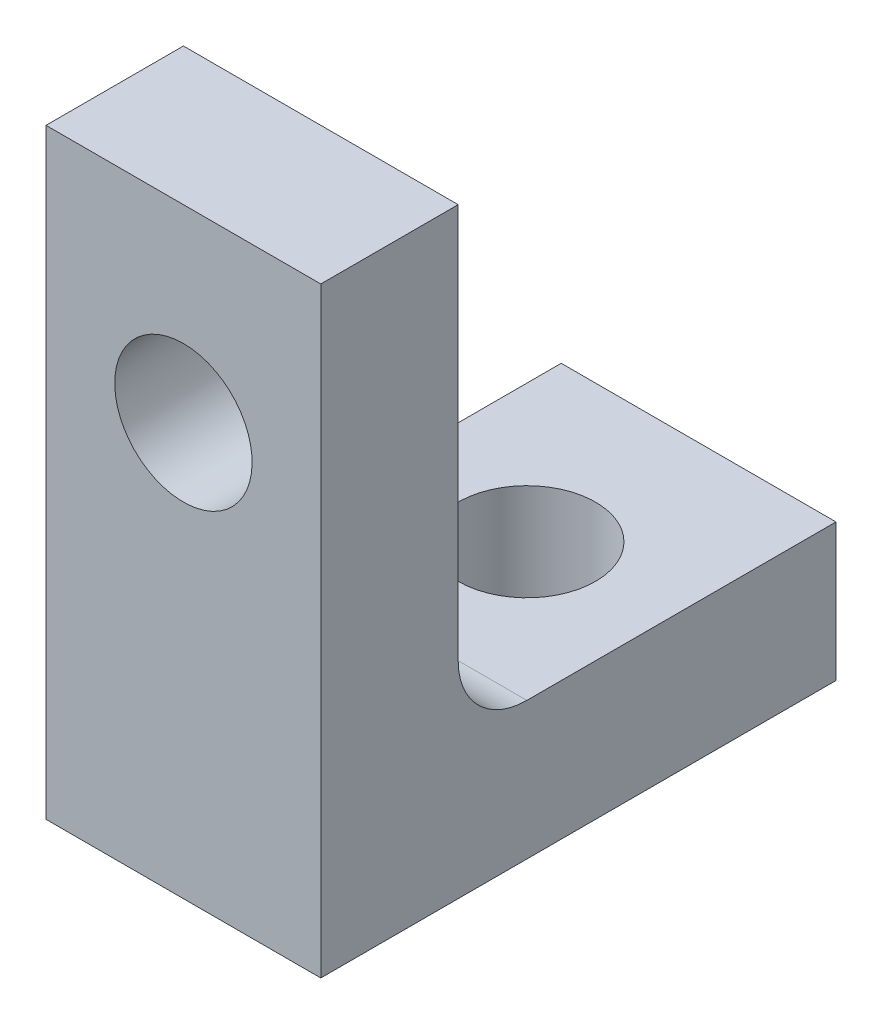
ISO-10303-21;
HEADER;
FILE_DESCRIPTION(('STEP AP214'),'2;1');
FILE_NAME('part.step','',(''),(''),'','','');
FILE_SCHEMA(('AUTOMOTIVE_DESIGN { 1 0 10303 214 1 1 1 1 }'));
ENDSEC;
DATA;
#1=APPLICATION_CONTEXT('core data for automotive mechanical design processes');
#2=APPLICATION_PROTOCOL_DEFINITION('international standard','automotive_design',2000,#1);
#3=PRODUCT_CONTEXT('',#1,'mechanical');
#4=PRODUCT('Part','Part','',(#3));
#5=PRODUCT_RELATED_PRODUCT_CATEGORY('part','',(#4));
#6=PRODUCT_DEFINITION_FORMATION('','',#4);
#7=PRODUCT_DEFINITION_CONTEXT('part definition',#1,'design');
#8=PRODUCT_DEFINITION('design','',#6,#7);
#9=PRODUCT_DEFINITION_SHAPE('','',#8);
#10=(LENGTH_UNIT() NAMED_UNIT(*) SI_UNIT(.MILLI.,.METRE.));
#11=(NAMED_UNIT(*) PLANE_ANGLE_UNIT() SI_UNIT($,.RADIAN.));
#12=(NAMED_UNIT(*) SI_UNIT($,.STERADIAN.) SOLID_ANGLE_UNIT());
#13=UNCERTAINTY_MEASURE_WITH_UNIT(LENGTH_MEASURE(1.E-05),#10,'distance_accuracy_value','');
#14=(GEOMETRIC_REPRESENTATION_CONTEXT(3) GLOBAL_UNCERTAINTY_ASSIGNED_CONTEXT((#13)) GLOBAL_UNIT_ASSIGNED_CONTEXT((#10,
#11,#12)) REPRESENTATION_CONTEXT('',''));
#15=CARTESIAN_POINT('',(0.,0.,0.));
#16=DIRECTION('',(0.,0.,1.));
#17=DIRECTION('',(1.,0.,0.));
#18=AXIS2_PLACEMENT_3D('',#15,#16,#17);
#19=CARTESIAN_POINT('',(4.,0.,-5.5));
#20=DIRECTION('',(0.,-1.,0.));
#21=DIRECTION('',(0.,0.,-1.));
#22=AXIS2_PLACEMENT_3D('',#19,#20,#21);
#23=PLANE('',#22);
#24=CARTESIAN_POINT('',(2.,0.,-3.));
#25=DIRECTION('',(0.,1.,0.));
#26=DIRECTION('',(0.,0.,1.));
#27=AXIS2_PLACEMENT_3D('',#24,#25,#26);
#28=CIRCLE('',#27,1.);
#29=CARTESIAN_POINT('',(2.,0.,-2.));
#30=VERTEX_POINT('',#29);
#31=EDGE_CURVE('E176',#30,#30,#28,.T.);
#32=ORIENTED_EDGE('',*,*,#31,.F.);
#33=EDGE_LOOP('',(#32));
#34=FACE_BOUND('',#33,.T.);
#35=DIRECTION('',(0.,0.,1.));
#36=VECTOR('',#35,1.);
#37=CARTESIAN_POINT('',(0.,0.,-5.5));
#38=LINE('',#37,#36);
#39=CARTESIAN_POINT('',(0.,0.,-5.5));
#40=VERTEX_POINT('',#39);
#41=CARTESIAN_POINT('',(0.,0.,-1.));
#42=VERTEX_POINT('',#41);
#43=EDGE_CURVE('E132',#40,#42,#38,.T.);
#44=ORIENTED_EDGE('',*,*,#43,.T.);
#45=DIRECTION('',(-1.,0.,0.));
#46=VECTOR('',#45,1.);
#47=CARTESIAN_POINT('',(4.,0.,-1.));
#48=LINE('',#47,#46);
#49=CARTESIAN_POINT('',(4.,0.,-1.));
#50=VERTEX_POINT('',#49);
#51=EDGE_CURVE('E53',#42,#50,#48,.F.);
#52=ORIENTED_EDGE('',*,*,#51,.T.);
#53=DIRECTION('',(0.,0.,1.));
#54=VECTOR('',#53,1.);
#55=CARTESIAN_POINT('',(4.,0.,-5.5));
#56=LINE('',#55,#54);
#57=CARTESIAN_POINT('',(4.,0.,-5.5));
#58=VERTEX_POINT('',#57);
#59=EDGE_CURVE('E110',#58,#50,#56,.T.);
#60=ORIENTED_EDGE('',*,*,#59,.F.);
#61=DIRECTION('',(-1.,0.,0.));
#62=VECTOR('',#61,1.);
#63=CARTESIAN_POINT('',(4.,0.,-5.5));
#64=LINE('',#63,#62);
#65=EDGE_CURVE('E128',#58,#40,#64,.T.);
#66=ORIENTED_EDGE('',*,*,#65,.T.);
#67=EDGE_LOOP('',(#44,#52,#60,#66));
#68=FACE_BOUND('',#67,.T.);
#69=ADVANCED_FACE('F39',(#34,#68),#23,.F.);
#70=CARTESIAN_POINT('',(4.,0.,0.));
#71=DIRECTION('',(0.,0.,1.));
#72=DIRECTION('',(0.,-1.,0.));
#73=AXIS2_PLACEMENT_3D('',#70,#71,#72);
#74=PLANE('',#73);
#75=CARTESIAN_POINT('',(2.,4.,0.));
#76=DIRECTION('',(0.,0.,-1.));
#77=DIRECTION('',(0.,1.,0.));
#78=AXIS2_PLACEMENT_3D('',#75,#76,#77);
#79=CIRCLE('',#78,1.);
#80=CARTESIAN_POINT('',(2.,5.,0.));
#81=VERTEX_POINT('',#80);
#82=EDGE_CURVE('E168',#81,#81,#79,.T.);
#83=ORIENTED_EDGE('',*,*,#82,.F.);
#84=EDGE_LOOP('',(#83));
#85=FACE_BOUND('',#84,.T.);
#86=DIRECTION('',(0.,1.,0.));
#87=VECTOR('',#86,1.);
#88=CARTESIAN_POINT('',(4.,0.,0.));
#89=LINE('',#88,#87);
#90=CARTESIAN_POINT('',(4.,1.,0.));
#91=VERTEX_POINT('',#90);
#92=CARTESIAN_POINT('',(4.,6.75,0.));
#93=VERTEX_POINT('',#92);
#94=EDGE_CURVE('E100',#91,#93,#89,.T.);
#95=ORIENTED_EDGE('',*,*,#94,.F.);
#96=DIRECTION('',(-1.,0.,0.));
#97=VECTOR('',#96,1.);
#98=CARTESIAN_POINT('',(0.,1.,0.));
#99=LINE('',#98,#97);
#100=CARTESIAN_POINT('',(0.,1.,0.));
#101=VERTEX_POINT('',#100);
#102=EDGE_CURVE('E113',#91,#101,#99,.T.);
#103=ORIENTED_EDGE('',*,*,#102,.T.);
#104=DIRECTION('',(0.,1.,0.));
#105=VECTOR('',#104,1.);
#106=CARTESIAN_POINT('',(0.,0.,0.));
#107=LINE('',#106,#105);
#108=CARTESIAN_POINT('',(0.,6.75,0.));
#109=VERTEX_POINT('',#108);
#110=EDGE_CURVE('E115',#101,#109,#107,.T.);
#111=ORIENTED_EDGE('',*,*,#110,.T.);
#112=DIRECTION('',(-1.,0.,0.));
#113=VECTOR('',#112,1.);
#114=CARTESIAN_POINT('',(4.,6.75,0.));
#115=LINE('',#114,#113);
#116=EDGE_CURVE('E109',#93,#109,#115,.T.);
#117=ORIENTED_EDGE('',*,*,#116,.F.);
#118=EDGE_LOOP('',(#95,#103,#111,#117));
#119=FACE_BOUND('',#118,.T.);
#120=ADVANCED_FACE('F112',(#85,#119),#74,.F.);
#121=CARTESIAN_POINT('',(4.,6.75,0.));
#122=DIRECTION('',(0.,-1.,0.));
#123=DIRECTION('',(0.,0.,-1.));
#124=AXIS2_PLACEMENT_3D('',#121,#122,#123);
#125=PLANE('',#124);
#126=DIRECTION('',(0.,0.,1.));
#127=VECTOR('',#126,1.);
#128=CARTESIAN_POINT('',(0.,6.75,0.));
#129=LINE('',#128,#127);
#130=CARTESIAN_POINT('',(0.,6.75,2.));
#131=VERTEX_POINT('',#130);
#132=EDGE_CURVE('E133',#109,#131,#129,.T.);
#133=ORIENTED_EDGE('',*,*,#132,.T.);
#134=DIRECTION('',(-1.,0.,0.));
#135=VECTOR('',#134,1.);
#136=CARTESIAN_POINT('',(4.,6.75,2.));
#137=LINE('',#136,#135);
#138=CARTESIAN_POINT('',(4.,6.75,2.));
#139=VERTEX_POINT('',#138);
#140=EDGE_CURVE('E117',#139,#131,#137,.T.);
#141=ORIENTED_EDGE('',*,*,#140,.F.);
#142=DIRECTION('',(0.,0.,1.));
#143=VECTOR('',#142,1.);
#144=CARTESIAN_POINT('',(4.,6.75,0.));
#145=LINE('',#144,#143);
#146=EDGE_CURVE('E101',#93,#139,#145,.T.);
#147=ORIENTED_EDGE('',*,*,#146,.F.);
#148=ORIENTED_EDGE('',*,*,#116,.T.);
#149=EDGE_LOOP('',(#133,#141,#147,#148));
#150=FACE_BOUND('',#149,.T.);
#151=ADVANCED_FACE('F119',(#150),#125,.F.);
#152=CARTESIAN_POINT('',(4.,6.75,2.));
#153=DIRECTION('',(0.,0.,-1.));
#154=DIRECTION('',(0.,1.,0.));
#155=AXIS2_PLACEMENT_3D('',#152,#153,#154);
#156=PLANE('',#155);
#157=CARTESIAN_POINT('',(2.,4.,2.));
#158=DIRECTION('',(0.,0.,-1.));
#159=DIRECTION('',(0.,1.,0.));
#160=AXIS2_PLACEMENT_3D('',#157,#158,#159);
#161=CIRCLE('',#160,1.);
#162=CARTESIAN_POINT('',(2.,5.,2.));
#163=VERTEX_POINT('',#162);
#164=EDGE_CURVE('E134',#163,#163,#161,.T.);
#165=ORIENTED_EDGE('',*,*,#164,.T.);
#166=EDGE_LOOP('',(#165));
#167=FACE_BOUND('',#166,.T.);
#168=DIRECTION('',(0.,-1.,0.));
#169=VECTOR('',#168,1.);
#170=CARTESIAN_POINT('',(0.,6.75,2.));
#171=LINE('',#170,#169);
#172=CARTESIAN_POINT('',(0.,-2.,2.));
#173=VERTEX_POINT('',#172);
#174=EDGE_CURVE('E137',#131,#173,#171,.T.);
#175=ORIENTED_EDGE('',*,*,#174,.T.);
#176=DIRECTION('',(-1.,0.,0.));
#177=VECTOR('',#176,1.);
#178=CARTESIAN_POINT('',(4.,-2.,2.));
#179=LINE('',#178,#177);
#180=CARTESIAN_POINT('',(4.,-2.,2.));
#181=VERTEX_POINT('',#180);
#182=EDGE_CURVE('E146',#181,#173,#179,.T.);
#183=ORIENTED_EDGE('',*,*,#182,.F.);
#184=DIRECTION('',(0.,-1.,0.));
#185=VECTOR('',#184,1.);
#186=CARTESIAN_POINT('',(4.,6.75,2.));
#187=LINE('',#186,#185);
#188=EDGE_CURVE('E121',#139,#181,#187,.T.);
#189=ORIENTED_EDGE('',*,*,#188,.F.);
#190=ORIENTED_EDGE('',*,*,#140,.T.);
#191=EDGE_LOOP('',(#175,#183,#189,#190));
#192=FACE_BOUND('',#191,.T.);
#193=ADVANCED_FACE('F158',(#167,#192),#156,.F.);
#194=CARTESIAN_POINT('',(4.,-2.,2.));
#195=DIRECTION('',(0.,1.,0.));
#196=DIRECTION('',(0.,0.,1.));
#197=AXIS2_PLACEMENT_3D('',#194,#195,#196);
#198=PLANE('',#197);
#199=CARTESIAN_POINT('',(2.,-2.,-3.));
#200=DIRECTION('',(0.,1.,0.));
#201=DIRECTION('',(0.,0.,1.));
#202=AXIS2_PLACEMENT_3D('',#199,#200,#201);
#203=CIRCLE('',#202,1.);
#204=CARTESIAN_POINT('',(2.,-2.,-2.));
#205=VERTEX_POINT('',#204);
#206=EDGE_CURVE('E174',#205,#205,#203,.T.);
#207=ORIENTED_EDGE('',*,*,#206,.T.);
#208=EDGE_LOOP('',(#207));
#209=FACE_BOUND('',#208,.T.);
#210=DIRECTION('',(0.,0.,-1.));
#211=VECTOR('',#210,1.);
#212=CARTESIAN_POINT('',(0.,-2.,2.));
#213=LINE('',#212,#211);
#214=CARTESIAN_POINT('',(0.,-2.,-5.5));
#215=VERTEX_POINT('',#214);
#216=EDGE_CURVE('E138',#173,#215,#213,.T.);
#217=ORIENTED_EDGE('',*,*,#216,.T.);
#218=DIRECTION('',(-1.,0.,0.));
#219=VECTOR('',#218,1.);
#220=CARTESIAN_POINT('',(4.,-2.,-5.5));
#221=LINE('',#220,#219);
#222=CARTESIAN_POINT('',(4.,-2.,-5.5));
#223=VERTEX_POINT('',#222);
#224=EDGE_CURVE('E144',#223,#215,#221,.T.);
#225=ORIENTED_EDGE('',*,*,#224,.F.);
#226=DIRECTION('',(0.,0.,-1.));
#227=VECTOR('',#226,1.);
#228=CARTESIAN_POINT('',(4.,-2.,2.));
#229=LINE('',#228,#227);
#230=EDGE_CURVE('E124',#181,#223,#229,.T.);
#231=ORIENTED_EDGE('',*,*,#230,.F.);
#232=ORIENTED_EDGE('',*,*,#182,.T.);
#233=EDGE_LOOP('',(#217,#225,#231,#232));
#234=FACE_BOUND('',#233,.T.);
#235=ADVANCED_FACE('F164',(#209,#234),#198,.F.);
#236=CARTESIAN_POINT('',(4.,-2.,-5.5));
#237=DIRECTION('',(0.,0.,1.));
#238=DIRECTION('',(1.,0.,0.));
#239=AXIS2_PLACEMENT_3D('',#236,#237,#238);
#240=PLANE('',#239);
#241=DIRECTION('',(0.,1.,0.));
#242=VECTOR('',#241,1.);
#243=CARTESIAN_POINT('',(0.,-2.,-5.5));
#244=LINE('',#243,#242);
#245=EDGE_CURVE('E143',#215,#40,#244,.T.);
#246=ORIENTED_EDGE('',*,*,#245,.T.);
#247=ORIENTED_EDGE('',*,*,#65,.F.);
#248=DIRECTION('',(0.,1.,0.));
#249=VECTOR('',#248,1.);
#250=CARTESIAN_POINT('',(4.,-2.,-5.5));
#251=LINE('',#250,#249);
#252=EDGE_CURVE('E126',#223,#58,#251,.T.);
#253=ORIENTED_EDGE('',*,*,#252,.F.);
#254=ORIENTED_EDGE('',*,*,#224,.T.);
#255=EDGE_LOOP('',(#246,#247,#253,#254));
#256=FACE_BOUND('',#255,.T.);
#257=ADVANCED_FACE('F169',(#256),#240,.F.);
#258=CARTESIAN_POINT('',(4.,0.,0.));
#259=DIRECTION('',(-1.,0.,0.));
#260=DIRECTION('',(0.,0.,1.));
#261=AXIS2_PLACEMENT_3D('',#258,#259,#260);
#262=PLANE('',#261);
#263=ORIENTED_EDGE('',*,*,#59,.T.);
#264=CARTESIAN_POINT('',(4.,1.,-1.));
#265=DIRECTION('',(-1.,0.,0.));
#266=DIRECTION('',(0.,0.,1.));
#267=AXIS2_PLACEMENT_3D('',#264,#265,#266);
#268=CIRCLE('',#267,1.);
#269=EDGE_CURVE('E11',#50,#91,#268,.T.);
#270=ORIENTED_EDGE('',*,*,#269,.T.);
#271=ORIENTED_EDGE('',*,*,#94,.T.);
#272=ORIENTED_EDGE('',*,*,#146,.T.);
#273=ORIENTED_EDGE('',*,*,#188,.T.);
#274=ORIENTED_EDGE('',*,*,#230,.T.);
#275=ORIENTED_EDGE('',*,*,#252,.T.);
#276=EDGE_LOOP('',(#263,#270,#271,#272,#273,#274,#275));
#277=FACE_BOUND('',#276,.T.);
#278=ADVANCED_FACE('F97',(#277),#262,.F.);
#279=CARTESIAN_POINT('',(0.,0.,0.));
#280=DIRECTION('',(-1.,0.,0.));
#281=DIRECTION('',(0.,0.,1.));
#282=AXIS2_PLACEMENT_3D('',#279,#280,#281);
#283=PLANE('',#282);
#284=ORIENTED_EDGE('',*,*,#43,.F.);
#285=ORIENTED_EDGE('',*,*,#245,.F.);
#286=ORIENTED_EDGE('',*,*,#216,.F.);
#287=ORIENTED_EDGE('',*,*,#174,.F.);
#288=ORIENTED_EDGE('',*,*,#132,.F.);
#289=ORIENTED_EDGE('',*,*,#110,.F.);
#290=CARTESIAN_POINT('',(0.,1.,-1.));
#291=DIRECTION('',(-1.,0.,0.));
#292=DIRECTION('',(0.,0.,1.));
#293=AXIS2_PLACEMENT_3D('',#290,#291,#292);
#294=CIRCLE('',#293,1.);
#295=EDGE_CURVE('E50',#101,#42,#294,.F.);
#296=ORIENTED_EDGE('',*,*,#295,.T.);
#297=EDGE_LOOP('',(#284,#285,#286,#287,#288,#289,#296));
#298=FACE_BOUND('',#297,.T.);
#299=ADVANCED_FACE('F152',(#298),#283,.T.);
#300=CARTESIAN_POINT('',(2.,4.,2.));
#301=DIRECTION('',(0.,0.,-1.));
#302=DIRECTION('',(0.,1.,0.));
#303=AXIS2_PLACEMENT_3D('',#300,#301,#302);
#304=CYLINDRICAL_SURFACE('',#303,1.);
#305=ORIENTED_EDGE('',*,*,#164,.F.);
#306=EDGE_LOOP('',(#305));
#307=FACE_BOUND('',#306,.T.);
#308=ORIENTED_EDGE('',*,*,#82,.T.);
#309=EDGE_LOOP('',(#308));
#310=FACE_BOUND('',#309,.T.);
#311=ADVANCED_FACE('F187',(#307,#310),#304,.F.);
#312=CARTESIAN_POINT('',(2.,-2.,-3.));
#313=DIRECTION('',(0.,1.,0.));
#314=DIRECTION('',(0.,0.,1.));
#315=AXIS2_PLACEMENT_3D('',#312,#313,#314);
#316=CYLINDRICAL_SURFACE('',#315,1.);
#317=ORIENTED_EDGE('',*,*,#206,.F.);
#318=EDGE_LOOP('',(#317));
#319=FACE_BOUND('',#318,.T.);
#320=ORIENTED_EDGE('',*,*,#31,.T.);
#321=EDGE_LOOP('',(#320));
#322=FACE_BOUND('',#321,.T.);
#323=ADVANCED_FACE('F181',(#319,#322),#316,.F.);
#324=CARTESIAN_POINT('',(4.,1.,-1.));
#325=DIRECTION('',(1.,0.,0.));
#326=DIRECTION('',(0.,0.,-1.));
#327=AXIS2_PLACEMENT_3D('',#324,#325,#326);
#328=CYLINDRICAL_SURFACE('',#327,1.);
#329=ORIENTED_EDGE('',*,*,#269,.F.);
#330=ORIENTED_EDGE('',*,*,#51,.F.);
#331=ORIENTED_EDGE('',*,*,#295,.F.);
#332=ORIENTED_EDGE('',*,*,#102,.F.);
#333=EDGE_LOOP('',(#329,#330,#331,#332));
#334=FACE_BOUND('',#333,.T.);
#335=ADVANCED_FACE('F41',(#334),#328,.F.);
#336=CLOSED_SHELL('',(#69,#120,#151,#193,#235,#257,#278,#299,#311,#323,#335));
#337=MANIFOLD_SOLID_BREP('B2',#336);
#338=ADVANCED_BREP_SHAPE_REPRESENTATION('',(#18,#337),#14);
#339=SHAPE_DEFINITION_REPRESENTATION(#9,#338);
ENDSEC;
END-ISO-10303-21;
